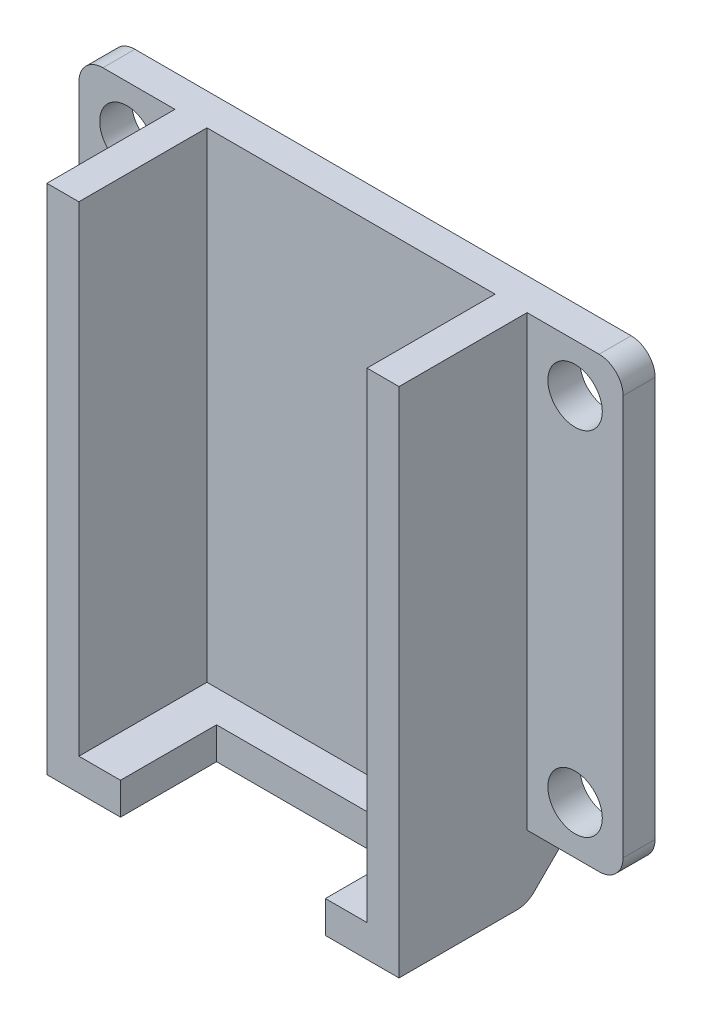
ISO-10303-21;
HEADER;
FILE_DESCRIPTION(('STEP AP214'),'2;1');
FILE_NAME('part.step','',(''),(''),'','','');
FILE_SCHEMA(('AUTOMOTIVE_DESIGN { 1 0 10303 214 1 1 1 1 }'));
ENDSEC;
DATA;
#1=APPLICATION_CONTEXT('core data for automotive mechanical design processes');
#2=APPLICATION_PROTOCOL_DEFINITION('international standard','automotive_design',2000,#1);
#3=PRODUCT_CONTEXT('',#1,'mechanical');
#4=PRODUCT('Part','Part','',(#3));
#5=PRODUCT_RELATED_PRODUCT_CATEGORY('part','',(#4));
#6=PRODUCT_DEFINITION_FORMATION('','',#4);
#7=PRODUCT_DEFINITION_CONTEXT('part definition',#1,'design');
#8=PRODUCT_DEFINITION('design','',#6,#7);
#9=PRODUCT_DEFINITION_SHAPE('','',#8);
#10=(LENGTH_UNIT() NAMED_UNIT(*) SI_UNIT(.MILLI.,.METRE.));
#11=(NAMED_UNIT(*) PLANE_ANGLE_UNIT() SI_UNIT($,.RADIAN.));
#12=(NAMED_UNIT(*) SI_UNIT($,.STERADIAN.) SOLID_ANGLE_UNIT());
#13=UNCERTAINTY_MEASURE_WITH_UNIT(LENGTH_MEASURE(1.E-05),#10,'distance_accuracy_value','');
#14=(GEOMETRIC_REPRESENTATION_CONTEXT(3) GLOBAL_UNCERTAINTY_ASSIGNED_CONTEXT((#13)) GLOBAL_UNIT_ASSIGNED_CONTEXT((#10,
#11,#12)) REPRESENTATION_CONTEXT('',''));
#15=CARTESIAN_POINT('',(0.,0.,0.));
#16=DIRECTION('',(0.,0.,1.));
#17=DIRECTION('',(1.,0.,0.));
#18=AXIS2_PLACEMENT_3D('',#15,#16,#17);
#19=CARTESIAN_POINT('',(0.,0.,2.));
#20=DIRECTION('',(0.,0.,-1.));
#21=DIRECTION('',(-1.,0.,0.));
#22=AXIS2_PLACEMENT_3D('',#19,#20,#21);
#23=PLANE('',#22);
#24=DIRECTION('',(1.,0.,0.));
#25=VECTOR('',#24,1.);
#26=CARTESIAN_POINT('',(0.,-14.,2.));
#27=LINE('',#26,#25);
#28=CARTESIAN_POINT('',(-9.00000000000001,-14.,2.));
#29=VERTEX_POINT('',#28);
#30=CARTESIAN_POINT('',(9.,-14.,2.));
#31=VERTEX_POINT('',#30);
#32=EDGE_CURVE('E238',#29,#31,#27,.T.);
#33=ORIENTED_EDGE('',*,*,#32,.T.);
#34=DIRECTION('',(0.,-1.,0.));
#35=VECTOR('',#34,1.);
#36=CARTESIAN_POINT('',(9.,0.,2.));
#37=LINE('',#36,#35);
#38=CARTESIAN_POINT('',(8.99999999999999,16.,2.));
#39=VERTEX_POINT('',#38);
#40=EDGE_CURVE('E429',#39,#31,#37,.T.);
#41=ORIENTED_EDGE('',*,*,#40,.F.);
#42=DIRECTION('',(-1.,0.,0.));
#43=VECTOR('',#42,1.);
#44=CARTESIAN_POINT('',(-17.,16.,2.));
#45=LINE('',#44,#43);
#46=CARTESIAN_POINT('',(-9.00000000000001,16.,2.));
#47=VERTEX_POINT('',#46);
#48=EDGE_CURVE('E285',#39,#47,#45,.T.);
#49=ORIENTED_EDGE('',*,*,#48,.T.);
#50=DIRECTION('',(0.,-1.,0.));
#51=VECTOR('',#50,1.);
#52=CARTESIAN_POINT('',(-9.00000000000001,0.,2.));
#53=LINE('',#52,#51);
#54=EDGE_CURVE('E239',#47,#29,#53,.T.);
#55=ORIENTED_EDGE('',*,*,#54,.T.);
#56=EDGE_LOOP('',(#33,#41,#49,#55));
#57=FACE_BOUND('',#56,.T.);
#58=ADVANCED_FACE('F47',(#57),#23,.F.);
#59=CARTESIAN_POINT('',(-14.,13.,2.));
#60=DIRECTION('',(0.,0.,1.));
#61=DIRECTION('',(1.,0.,0.));
#62=AXIS2_PLACEMENT_3D('',#59,#60,#61);
#63=CIRCLE('',#62,1.7);
#64=CARTESIAN_POINT('',(-12.3,13.,2.));
#65=VERTEX_POINT('',#64);
#66=EDGE_CURVE('E326',#65,#65,#63,.T.);
#67=ORIENTED_EDGE('',*,*,#66,.F.);
#68=EDGE_LOOP('',(#67));
#69=FACE_BOUND('',#68,.T.);
#70=CARTESIAN_POINT('',(-14.,-9.00000000000001,2.));
#71=DIRECTION('',(0.,0.,1.));
#72=DIRECTION('',(1.,0.,0.));
#73=AXIS2_PLACEMENT_3D('',#70,#71,#72);
#74=CIRCLE('',#73,1.7);
#75=CARTESIAN_POINT('',(-12.3,-9.00000000000001,2.));
#76=VERTEX_POINT('',#75);
#77=EDGE_CURVE('E316',#76,#76,#74,.T.);
#78=ORIENTED_EDGE('',*,*,#77,.F.);
#79=EDGE_LOOP('',(#78));
#80=FACE_BOUND('',#79,.T.);
#81=CARTESIAN_POINT('',(-11.,16.,2.));
#82=VERTEX_POINT('',#81);
#83=CARTESIAN_POINT('',(-15.5,16.,2.));
#84=VERTEX_POINT('',#83);
#85=EDGE_CURVE('E279',#82,#84,#45,.T.);
#86=ORIENTED_EDGE('',*,*,#85,.T.);
#87=CARTESIAN_POINT('',(-15.5,14.5,2.));
#88=DIRECTION('',(0.,0.,-1.));
#89=DIRECTION('',(-1.,0.,0.));
#90=AXIS2_PLACEMENT_3D('',#87,#88,#89);
#91=CIRCLE('',#90,1.5);
#92=CARTESIAN_POINT('',(-17.,14.5,2.));
#93=VERTEX_POINT('',#92);
#94=EDGE_CURVE('E355',#84,#93,#91,.F.);
#95=ORIENTED_EDGE('',*,*,#94,.T.);
#96=DIRECTION('',(0.,-1.,0.));
#97=VECTOR('',#96,1.);
#98=CARTESIAN_POINT('',(-17.,-16.,2.));
#99=LINE('',#98,#97);
#100=CARTESIAN_POINT('',(-17.,-10.5,2.));
#101=VERTEX_POINT('',#100);
#102=EDGE_CURVE('E284',#93,#101,#99,.T.);
#103=ORIENTED_EDGE('',*,*,#102,.T.);
#104=CARTESIAN_POINT('',(-15.5,-10.5,2.));
#105=DIRECTION('',(0.,0.,-1.));
#106=DIRECTION('',(-1.,0.,0.));
#107=AXIS2_PLACEMENT_3D('',#104,#105,#106);
#108=CIRCLE('',#107,1.5);
#109=CARTESIAN_POINT('',(-15.5,-12.,2.));
#110=VERTEX_POINT('',#109);
#111=EDGE_CURVE('E228',#101,#110,#108,.F.);
#112=ORIENTED_EDGE('',*,*,#111,.T.);
#113=DIRECTION('',(-1.,0.,0.));
#114=VECTOR('',#113,1.);
#115=CARTESIAN_POINT('',(-17.,-12.,2.));
#116=LINE('',#115,#114);
#117=CARTESIAN_POINT('',(-11.,-12.,2.));
#118=VERTEX_POINT('',#117);
#119=EDGE_CURVE('E211',#118,#110,#116,.T.);
#120=ORIENTED_EDGE('',*,*,#119,.F.);
#121=DIRECTION('',(0.,-1.,0.));
#122=VECTOR('',#121,1.);
#123=CARTESIAN_POINT('',(-11.,0.,2.));
#124=LINE('',#123,#122);
#125=EDGE_CURVE('E225',#82,#118,#124,.T.);
#126=ORIENTED_EDGE('',*,*,#125,.F.);
#127=EDGE_LOOP('',(#86,#95,#103,#112,#120,#126));
#128=FACE_BOUND('',#127,.T.);
#129=ADVANCED_FACE('F224',(#69,#80,#128),#23,.F.);
#130=CARTESIAN_POINT('',(17.,-16.,2.));
#131=DIRECTION('',(-1.,0.,0.));
#132=DIRECTION('',(0.,0.,1.));
#133=AXIS2_PLACEMENT_3D('',#130,#131,#132);
#134=PLANE('',#133);
#135=DIRECTION('',(0.,1.,0.));
#136=VECTOR('',#135,1.);
#137=CARTESIAN_POINT('',(17.,-16.,0.));
#138=LINE('',#137,#136);
#139=CARTESIAN_POINT('',(17.,-10.5,0.));
#140=VERTEX_POINT('',#139);
#141=CARTESIAN_POINT('',(17.,14.5,0.));
#142=VERTEX_POINT('',#141);
#143=EDGE_CURVE('E274',#140,#142,#138,.T.);
#144=ORIENTED_EDGE('',*,*,#143,.T.);
#145=DIRECTION('',(0.,0.,-1.));
#146=VECTOR('',#145,1.);
#147=CARTESIAN_POINT('',(17.,14.5,2.));
#148=LINE('',#147,#146);
#149=CARTESIAN_POINT('',(17.,14.5,2.));
#150=VERTEX_POINT('',#149);
#151=EDGE_CURVE('E360',#142,#150,#148,.F.);
#152=ORIENTED_EDGE('',*,*,#151,.T.);
#153=DIRECTION('',(0.,1.,0.));
#154=VECTOR('',#153,1.);
#155=CARTESIAN_POINT('',(17.,-16.,2.));
#156=LINE('',#155,#154);
#157=CARTESIAN_POINT('',(17.,-10.5,2.));
#158=VERTEX_POINT('',#157);
#159=EDGE_CURVE('E275',#158,#150,#156,.T.);
#160=ORIENTED_EDGE('',*,*,#159,.F.);
#161=DIRECTION('',(0.,0.,1.));
#162=VECTOR('',#161,1.);
#163=CARTESIAN_POINT('',(17.,-10.5,2.));
#164=LINE('',#163,#162);
#165=EDGE_CURVE('E357',#158,#140,#164,.F.);
#166=ORIENTED_EDGE('',*,*,#165,.T.);
#167=EDGE_LOOP('',(#144,#152,#160,#166));
#168=FACE_BOUND('',#167,.T.);
#169=ADVANCED_FACE('F569',(#168),#134,.F.);
#170=CARTESIAN_POINT('',(-17.,16.,2.));
#171=DIRECTION('',(0.,-1.,0.));
#172=DIRECTION('',(0.,0.,-1.));
#173=AXIS2_PLACEMENT_3D('',#170,#171,#172);
#174=PLANE('',#173);
#175=DIRECTION('',(-1.,0.,0.));
#176=VECTOR('',#175,1.);
#177=CARTESIAN_POINT('',(-17.,16.,0.));
#178=LINE('',#177,#176);
#179=CARTESIAN_POINT('',(15.5,16.,0.));
#180=VERTEX_POINT('',#179);
#181=CARTESIAN_POINT('',(-15.5,16.,0.));
#182=VERTEX_POINT('',#181);
#183=EDGE_CURVE('E292',#180,#182,#178,.T.);
#184=ORIENTED_EDGE('',*,*,#183,.T.);
#185=DIRECTION('',(0.,0.,-1.));
#186=VECTOR('',#185,1.);
#187=CARTESIAN_POINT('',(-15.5,16.,2.));
#188=LINE('',#187,#186);
#189=EDGE_CURVE('E350',#182,#84,#188,.F.);
#190=ORIENTED_EDGE('',*,*,#189,.T.);
#191=ORIENTED_EDGE('',*,*,#85,.F.);
#192=DIRECTION('',(0.,0.,-1.));
#193=VECTOR('',#192,1.);
#194=CARTESIAN_POINT('',(-11.,16.,10.));
#195=LINE('',#194,#193);
#196=CARTESIAN_POINT('',(-11.,16.,10.));
#197=VERTEX_POINT('',#196);
#198=EDGE_CURVE('E236',#197,#82,#195,.T.);
#199=ORIENTED_EDGE('',*,*,#198,.F.);
#200=DIRECTION('',(-1.,0.,0.));
#201=VECTOR('',#200,1.);
#202=CARTESIAN_POINT('',(0.,16.,10.));
#203=LINE('',#202,#201);
#204=CARTESIAN_POINT('',(-9.00000000000001,16.,10.));
#205=VERTEX_POINT('',#204);
#206=EDGE_CURVE('E481',#205,#197,#203,.T.);
#207=ORIENTED_EDGE('',*,*,#206,.F.);
#208=DIRECTION('',(0.,0.,-1.));
#209=VECTOR('',#208,1.);
#210=CARTESIAN_POINT('',(-9.00000000000001,16.,10.));
#211=LINE('',#210,#209);
#212=EDGE_CURVE('E270',#205,#47,#211,.T.);
#213=ORIENTED_EDGE('',*,*,#212,.T.);
#214=ORIENTED_EDGE('',*,*,#48,.F.);
#215=DIRECTION('',(0.,0.,-1.));
#216=VECTOR('',#215,1.);
#217=CARTESIAN_POINT('',(8.99999999999999,16.,10.));
#218=LINE('',#217,#216);
#219=CARTESIAN_POINT('',(8.99999999999999,16.,10.));
#220=VERTEX_POINT('',#219);
#221=EDGE_CURVE('E247',#220,#39,#218,.T.);
#222=ORIENTED_EDGE('',*,*,#221,.F.);
#223=DIRECTION('',(-1.,0.,0.));
#224=VECTOR('',#223,1.);
#225=CARTESIAN_POINT('',(0.,16.,10.));
#226=LINE('',#225,#224);
#227=CARTESIAN_POINT('',(11.,16.,10.));
#228=VERTEX_POINT('',#227);
#229=EDGE_CURVE('E430',#228,#220,#226,.T.);
#230=ORIENTED_EDGE('',*,*,#229,.F.);
#231=DIRECTION('',(0.,0.,-1.));
#232=VECTOR('',#231,1.);
#233=CARTESIAN_POINT('',(11.,16.,10.));
#234=LINE('',#233,#232);
#235=CARTESIAN_POINT('',(11.,16.,2.));
#236=VERTEX_POINT('',#235);
#237=EDGE_CURVE('E451',#228,#236,#234,.T.);
#238=ORIENTED_EDGE('',*,*,#237,.T.);
#239=CARTESIAN_POINT('',(15.5,16.,2.));
#240=VERTEX_POINT('',#239);
#241=EDGE_CURVE('E281',#240,#236,#45,.T.);
#242=ORIENTED_EDGE('',*,*,#241,.F.);
#243=DIRECTION('',(0.,0.,-1.));
#244=VECTOR('',#243,1.);
#245=CARTESIAN_POINT('',(15.5,16.,2.));
#246=LINE('',#245,#244);
#247=EDGE_CURVE('E346',#240,#180,#246,.T.);
#248=ORIENTED_EDGE('',*,*,#247,.T.);
#249=EDGE_LOOP('',(#184,#190,#191,#199,#207,#213,#214,#222,#230,#238,#242,#248));
#250=FACE_BOUND('',#249,.T.);
#251=ADVANCED_FACE('F532',(#250),#174,.F.);
#252=CARTESIAN_POINT('',(-17.,-16.,2.));
#253=DIRECTION('',(1.,0.,0.));
#254=DIRECTION('',(0.,0.,-1.));
#255=AXIS2_PLACEMENT_3D('',#252,#253,#254);
#256=PLANE('',#255);
#257=ORIENTED_EDGE('',*,*,#102,.F.);
#258=DIRECTION('',(0.,0.,-1.));
#259=VECTOR('',#258,1.);
#260=CARTESIAN_POINT('',(-17.,14.5,2.));
#261=LINE('',#260,#259);
#262=CARTESIAN_POINT('',(-17.,14.5,0.));
#263=VERTEX_POINT('',#262);
#264=EDGE_CURVE('E330',#93,#263,#261,.T.);
#265=ORIENTED_EDGE('',*,*,#264,.T.);
#266=DIRECTION('',(0.,-1.,0.));
#267=VECTOR('',#266,1.);
#268=CARTESIAN_POINT('',(-17.,-16.,0.));
#269=LINE('',#268,#267);
#270=CARTESIAN_POINT('',(-17.,-10.5,0.));
#271=VERTEX_POINT('',#270);
#272=EDGE_CURVE('E280',#263,#271,#269,.T.);
#273=ORIENTED_EDGE('',*,*,#272,.T.);
#274=DIRECTION('',(0.,0.,1.));
#275=VECTOR('',#274,1.);
#276=CARTESIAN_POINT('',(-17.,-10.5,2.));
#277=LINE('',#276,#275);
#278=EDGE_CURVE('E310',#271,#101,#277,.T.);
#279=ORIENTED_EDGE('',*,*,#278,.T.);
#280=EDGE_LOOP('',(#257,#265,#273,#279));
#281=FACE_BOUND('',#280,.T.);
#282=ADVANCED_FACE('F545',(#281),#256,.F.);
#283=CARTESIAN_POINT('',(-17.,-16.,2.));
#284=DIRECTION('',(0.,1.,0.));
#285=DIRECTION('',(0.,0.,1.));
#286=AXIS2_PLACEMENT_3D('',#283,#284,#285);
#287=PLANE('',#286);
#288=DIRECTION('',(0.,0.,-1.));
#289=VECTOR('',#288,1.);
#290=CARTESIAN_POINT('',(-11.,-16.,10.));
#291=LINE('',#290,#289);
#292=CARTESIAN_POINT('',(-11.,-16.,10.));
#293=VERTEX_POINT('',#292);
#294=CARTESIAN_POINT('',(-11.,-16.,2.62132034355964));
#295=VERTEX_POINT('',#294);
#296=EDGE_CURVE('E264',#293,#295,#291,.T.);
#297=ORIENTED_EDGE('',*,*,#296,.T.);
#298=DIRECTION('',(1.,0.,0.));
#299=VECTOR('',#298,1.);
#300=CARTESIAN_POINT('',(11.,-16.,2.62132034355964));
#301=LINE('',#300,#299);
#302=CARTESIAN_POINT('',(11.,-16.,2.62132034355964));
#303=VERTEX_POINT('',#302);
#304=EDGE_CURVE('E385',#295,#303,#301,.T.);
#305=ORIENTED_EDGE('',*,*,#304,.T.);
#306=DIRECTION('',(0.,0.,-1.));
#307=VECTOR('',#306,1.);
#308=CARTESIAN_POINT('',(11.,-16.,10.));
#309=LINE('',#308,#307);
#310=CARTESIAN_POINT('',(11.,-16.,10.));
#311=VERTEX_POINT('',#310);
#312=EDGE_CURVE('E461',#311,#303,#309,.T.);
#313=ORIENTED_EDGE('',*,*,#312,.F.);
#314=DIRECTION('',(1.,0.,0.));
#315=VECTOR('',#314,1.);
#316=CARTESIAN_POINT('',(0.,-16.,10.));
#317=LINE('',#316,#315);
#318=CARTESIAN_POINT('',(6.4,-16.,10.));
#319=VERTEX_POINT('',#318);
#320=EDGE_CURVE('E445',#319,#311,#317,.T.);
#321=ORIENTED_EDGE('',*,*,#320,.F.);
#322=DIRECTION('',(0.,0.,-1.));
#323=VECTOR('',#322,1.);
#324=CARTESIAN_POINT('',(6.4,-16.,10.));
#325=LINE('',#324,#323);
#326=CARTESIAN_POINT('',(6.4,-16.,4.));
#327=VERTEX_POINT('',#326);
#328=EDGE_CURVE('E464',#319,#327,#325,.T.);
#329=ORIENTED_EDGE('',*,*,#328,.T.);
#330=DIRECTION('',(1.,0.,0.));
#331=VECTOR('',#330,1.);
#332=CARTESIAN_POINT('',(0.,-16.,4.));
#333=LINE('',#332,#331);
#334=CARTESIAN_POINT('',(-6.4,-16.,4.));
#335=VERTEX_POINT('',#334);
#336=EDGE_CURVE('E426',#335,#327,#333,.T.);
#337=ORIENTED_EDGE('',*,*,#336,.F.);
#338=DIRECTION('',(0.,0.,-1.));
#339=VECTOR('',#338,1.);
#340=CARTESIAN_POINT('',(-6.4,-16.,10.));
#341=LINE('',#340,#339);
#342=CARTESIAN_POINT('',(-6.4,-16.,10.));
#343=VERTEX_POINT('',#342);
#344=EDGE_CURVE('E260',#343,#335,#341,.T.);
#345=ORIENTED_EDGE('',*,*,#344,.F.);
#346=DIRECTION('',(1.,0.,0.));
#347=VECTOR('',#346,1.);
#348=CARTESIAN_POINT('',(0.,-16.,10.));
#349=LINE('',#348,#347);
#350=EDGE_CURVE('E487',#293,#343,#349,.T.);
#351=ORIENTED_EDGE('',*,*,#350,.F.);
#352=EDGE_LOOP('',(#297,#305,#313,#321,#329,#337,#345,#351));
#353=FACE_BOUND('',#352,.T.);
#354=ADVANCED_FACE('F512',(#353),#287,.F.);
#355=CARTESIAN_POINT('',(14.,-9.00000000000001,2.));
#356=DIRECTION('',(0.,0.,1.));
#357=DIRECTION('',(1.,0.,0.));
#358=AXIS2_PLACEMENT_3D('',#355,#356,#357);
#359=CIRCLE('',#358,1.7);
#360=CARTESIAN_POINT('',(15.7,-9.00000000000001,2.));
#361=VERTEX_POINT('',#360);
#362=EDGE_CURVE('E321',#361,#361,#359,.T.);
#363=ORIENTED_EDGE('',*,*,#362,.F.);
#364=EDGE_LOOP('',(#363));
#365=FACE_BOUND('',#364,.T.);
#366=CARTESIAN_POINT('',(14.,13.,2.));
#367=DIRECTION('',(0.,0.,1.));
#368=DIRECTION('',(1.,0.,0.));
#369=AXIS2_PLACEMENT_3D('',#366,#367,#368);
#370=CIRCLE('',#369,1.7);
#371=CARTESIAN_POINT('',(15.7,13.,2.));
#372=VERTEX_POINT('',#371);
#373=EDGE_CURVE('E315',#372,#372,#370,.T.);
#374=ORIENTED_EDGE('',*,*,#373,.F.);
#375=EDGE_LOOP('',(#374));
#376=FACE_BOUND('',#375,.T.);
#377=ORIENTED_EDGE('',*,*,#159,.T.);
#378=CARTESIAN_POINT('',(15.5,14.5,2.));
#379=DIRECTION('',(0.,0.,-1.));
#380=DIRECTION('',(-1.,0.,0.));
#381=AXIS2_PLACEMENT_3D('',#378,#379,#380);
#382=CIRCLE('',#381,1.5);
#383=EDGE_CURVE('E366',#150,#240,#382,.F.);
#384=ORIENTED_EDGE('',*,*,#383,.T.);
#385=ORIENTED_EDGE('',*,*,#241,.T.);
#386=DIRECTION('',(0.,-1.,0.));
#387=VECTOR('',#386,1.);
#388=CARTESIAN_POINT('',(11.,0.,2.));
#389=LINE('',#388,#387);
#390=CARTESIAN_POINT('',(11.,-12.,2.));
#391=VERTEX_POINT('',#390);
#392=EDGE_CURVE('E435',#236,#391,#389,.T.);
#393=ORIENTED_EDGE('',*,*,#392,.T.);
#394=DIRECTION('',(-1.,0.,0.));
#395=VECTOR('',#394,1.);
#396=CARTESIAN_POINT('',(17.,-12.,2.));
#397=LINE('',#396,#395);
#398=CARTESIAN_POINT('',(15.5,-12.,2.));
#399=VERTEX_POINT('',#398);
#400=EDGE_CURVE('E230',#399,#391,#397,.T.);
#401=ORIENTED_EDGE('',*,*,#400,.F.);
#402=CARTESIAN_POINT('',(15.5,-10.5,2.));
#403=DIRECTION('',(0.,0.,-1.));
#404=DIRECTION('',(-1.,0.,0.));
#405=AXIS2_PLACEMENT_3D('',#402,#403,#404);
#406=CIRCLE('',#405,1.5);
#407=EDGE_CURVE('E363',#399,#158,#406,.F.);
#408=ORIENTED_EDGE('',*,*,#407,.T.);
#409=EDGE_LOOP('',(#377,#384,#385,#393,#401,#408));
#410=FACE_BOUND('',#409,.T.);
#411=ADVANCED_FACE('F566',(#365,#376,#410),#23,.F.);
#412=CARTESIAN_POINT('',(0.,0.,0.));
#413=DIRECTION('',(0.,0.,-1.));
#414=DIRECTION('',(-1.,0.,0.));
#415=AXIS2_PLACEMENT_3D('',#412,#413,#414);
#416=PLANE('',#415);
#417=CARTESIAN_POINT('',(-14.,13.,0.));
#418=DIRECTION('',(0.,0.,-1.));
#419=DIRECTION('',(-1.,0.,0.));
#420=AXIS2_PLACEMENT_3D('',#417,#418,#419);
#421=CIRCLE('',#420,1.7);
#422=CARTESIAN_POINT('',(-15.7,13.,0.));
#423=VERTEX_POINT('',#422);
#424=EDGE_CURVE('E322',#423,#423,#421,.T.);
#425=ORIENTED_EDGE('',*,*,#424,.F.);
#426=EDGE_LOOP('',(#425));
#427=FACE_BOUND('',#426,.T.);
#428=CARTESIAN_POINT('',(14.,-9.00000000000001,0.));
#429=DIRECTION('',(0.,0.,-1.));
#430=DIRECTION('',(-1.,0.,0.));
#431=AXIS2_PLACEMENT_3D('',#428,#429,#430);
#432=CIRCLE('',#431,1.7);
#433=CARTESIAN_POINT('',(12.3,-9.00000000000001,0.));
#434=VERTEX_POINT('',#433);
#435=EDGE_CURVE('E317',#434,#434,#432,.T.);
#436=ORIENTED_EDGE('',*,*,#435,.F.);
#437=EDGE_LOOP('',(#436));
#438=FACE_BOUND('',#437,.T.);
#439=CARTESIAN_POINT('',(-14.,-9.00000000000001,0.));
#440=DIRECTION('',(0.,0.,-1.));
#441=DIRECTION('',(-1.,0.,0.));
#442=AXIS2_PLACEMENT_3D('',#439,#440,#441);
#443=CIRCLE('',#442,1.7);
#444=CARTESIAN_POINT('',(-15.7,-9.00000000000001,0.));
#445=VERTEX_POINT('',#444);
#446=EDGE_CURVE('E311',#445,#445,#443,.T.);
#447=ORIENTED_EDGE('',*,*,#446,.F.);
#448=EDGE_LOOP('',(#447));
#449=FACE_BOUND('',#448,.T.);
#450=CARTESIAN_POINT('',(14.,13.,0.));
#451=DIRECTION('',(0.,0.,-1.));
#452=DIRECTION('',(-1.,0.,0.));
#453=AXIS2_PLACEMENT_3D('',#450,#451,#452);
#454=CIRCLE('',#453,1.7);
#455=CARTESIAN_POINT('',(12.3,13.,0.));
#456=VERTEX_POINT('',#455);
#457=EDGE_CURVE('E392',#456,#456,#454,.T.);
#458=ORIENTED_EDGE('',*,*,#457,.F.);
#459=EDGE_LOOP('',(#458));
#460=FACE_BOUND('',#459,.T.);
#461=DIRECTION('',(0.,1.,0.));
#462=VECTOR('',#461,1.);
#463=CARTESIAN_POINT('',(11.,0.,0.));
#464=LINE('',#463,#462);
#465=CARTESIAN_POINT('',(11.,-14.,0.));
#466=VERTEX_POINT('',#465);
#467=CARTESIAN_POINT('',(11.,-12.,0.));
#468=VERTEX_POINT('',#467);
#469=EDGE_CURVE('E302',#466,#468,#464,.T.);
#470=ORIENTED_EDGE('',*,*,#469,.F.);
#471=DIRECTION('',(-1.,0.,0.));
#472=VECTOR('',#471,1.);
#473=CARTESIAN_POINT('',(-11.,-14.,0.));
#474=LINE('',#473,#472);
#475=CARTESIAN_POINT('',(-11.,-14.,0.));
#476=VERTEX_POINT('',#475);
#477=EDGE_CURVE('E379',#466,#476,#474,.T.);
#478=ORIENTED_EDGE('',*,*,#477,.T.);
#479=DIRECTION('',(0.,-1.,0.));
#480=VECTOR('',#479,1.);
#481=CARTESIAN_POINT('',(-11.,0.,0.));
#482=LINE('',#481,#480);
#483=CARTESIAN_POINT('',(-11.,-12.,0.));
#484=VERTEX_POINT('',#483);
#485=EDGE_CURVE('E305',#484,#476,#482,.T.);
#486=ORIENTED_EDGE('',*,*,#485,.F.);
#487=DIRECTION('',(1.,0.,0.));
#488=VECTOR('',#487,1.);
#489=CARTESIAN_POINT('',(0.,-12.,0.));
#490=LINE('',#489,#488);
#491=CARTESIAN_POINT('',(-15.5,-12.,0.));
#492=VERTEX_POINT('',#491);
#493=EDGE_CURVE('E214',#492,#484,#490,.T.);
#494=ORIENTED_EDGE('',*,*,#493,.F.);
#495=CARTESIAN_POINT('',(-15.5,-10.5,0.));
#496=DIRECTION('',(0.,0.,-1.));
#497=DIRECTION('',(-1.,0.,0.));
#498=AXIS2_PLACEMENT_3D('',#495,#496,#497);
#499=CIRCLE('',#498,1.5);
#500=EDGE_CURVE('E334',#492,#271,#499,.T.);
#501=ORIENTED_EDGE('',*,*,#500,.T.);
#502=ORIENTED_EDGE('',*,*,#272,.F.);
#503=CARTESIAN_POINT('',(-15.5,14.5,0.));
#504=DIRECTION('',(0.,0.,-1.));
#505=DIRECTION('',(-1.,0.,0.));
#506=AXIS2_PLACEMENT_3D('',#503,#504,#505);
#507=CIRCLE('',#506,1.5);
#508=EDGE_CURVE('E343',#263,#182,#507,.T.);
#509=ORIENTED_EDGE('',*,*,#508,.T.);
#510=ORIENTED_EDGE('',*,*,#183,.F.);
#511=CARTESIAN_POINT('',(15.5,14.5,0.));
#512=DIRECTION('',(0.,0.,-1.));
#513=DIRECTION('',(-1.,0.,0.));
#514=AXIS2_PLACEMENT_3D('',#511,#512,#513);
#515=CIRCLE('',#514,1.5);
#516=EDGE_CURVE('E340',#180,#142,#515,.T.);
#517=ORIENTED_EDGE('',*,*,#516,.T.);
#518=ORIENTED_EDGE('',*,*,#143,.F.);
#519=CARTESIAN_POINT('',(15.5,-10.5,0.));
#520=DIRECTION('',(0.,0.,-1.));
#521=DIRECTION('',(-1.,0.,0.));
#522=AXIS2_PLACEMENT_3D('',#519,#520,#521);
#523=CIRCLE('',#522,1.5);
#524=CARTESIAN_POINT('',(15.5,-12.,0.));
#525=VERTEX_POINT('',#524);
#526=EDGE_CURVE('E337',#140,#525,#523,.T.);
#527=ORIENTED_EDGE('',*,*,#526,.T.);
#528=DIRECTION('',(1.,0.,0.));
#529=VECTOR('',#528,1.);
#530=CARTESIAN_POINT('',(0.,-12.,0.));
#531=LINE('',#530,#529);
#532=EDGE_CURVE('E288',#468,#525,#531,.T.);
#533=ORIENTED_EDGE('',*,*,#532,.F.);
#534=EDGE_LOOP('',(#470,#478,#486,#494,#501,#502,#509,#510,#517,#518,#527,#533));
#535=FACE_BOUND('',#534,.T.);
#536=ADVANCED_FACE('F549',(#427,#438,#449,#460,#535),#416,.T.);
#537=CARTESIAN_POINT('',(-9.00000000000001,0.,10.));
#538=DIRECTION('',(1.,0.,0.));
#539=DIRECTION('',(0.,1.,0.));
#540=AXIS2_PLACEMENT_3D('',#537,#538,#539);
#541=PLANE('',#540);
#542=ORIENTED_EDGE('',*,*,#54,.F.);
#543=ORIENTED_EDGE('',*,*,#212,.F.);
#544=DIRECTION('',(0.,-1.,0.));
#545=VECTOR('',#544,1.);
#546=CARTESIAN_POINT('',(-9.00000000000001,0.,10.));
#547=LINE('',#546,#545);
#548=CARTESIAN_POINT('',(-9.00000000000001,-14.,10.));
#549=VERTEX_POINT('',#548);
#550=EDGE_CURVE('E244',#205,#549,#547,.T.);
#551=ORIENTED_EDGE('',*,*,#550,.T.);
#552=DIRECTION('',(0.,0.,-1.));
#553=VECTOR('',#552,1.);
#554=CARTESIAN_POINT('',(-9.00000000000001,-14.,10.));
#555=LINE('',#554,#553);
#556=EDGE_CURVE('E251',#549,#29,#555,.T.);
#557=ORIENTED_EDGE('',*,*,#556,.T.);
#558=EDGE_LOOP('',(#542,#543,#551,#557));
#559=FACE_BOUND('',#558,.T.);
#560=ADVANCED_FACE('F578',(#559),#541,.T.);
#561=CARTESIAN_POINT('',(-11.,0.,10.));
#562=DIRECTION('',(1.,0.,0.));
#563=DIRECTION('',(0.,1.,0.));
#564=AXIS2_PLACEMENT_3D('',#561,#562,#563);
#565=PLANE('',#564);
#566=DIRECTION('',(0.,-0.707106781186549,0.707106781186546));
#567=VECTOR('',#566,1.);
#568=CARTESIAN_POINT('',(-11.,-16.,1.99999999999999));
#569=LINE('',#568,#567);
#570=CARTESIAN_POINT('',(-11.,-15.5606601717798,1.56066017177982));
#571=VERTEX_POINT('',#570);
#572=EDGE_CURVE('E382',#476,#571,#569,.T.);
#573=ORIENTED_EDGE('',*,*,#572,.T.);
#574=CARTESIAN_POINT('',(-11.,-14.5,2.62132034355964));
#575=DIRECTION('',(1.,0.,0.));
#576=DIRECTION('',(0.,1.,0.));
#577=AXIS2_PLACEMENT_3D('',#574,#575,#576);
#578=CIRCLE('',#577,1.5);
#579=EDGE_CURVE('E11',#571,#295,#578,.F.);
#580=ORIENTED_EDGE('',*,*,#579,.T.);
#581=ORIENTED_EDGE('',*,*,#296,.F.);
#582=DIRECTION('',(0.,-1.,0.));
#583=VECTOR('',#582,1.);
#584=CARTESIAN_POINT('',(-11.,0.,10.));
#585=LINE('',#584,#583);
#586=EDGE_CURVE('E484',#197,#293,#585,.T.);
#587=ORIENTED_EDGE('',*,*,#586,.F.);
#588=ORIENTED_EDGE('',*,*,#198,.T.);
#589=ORIENTED_EDGE('',*,*,#125,.T.);
#590=DIRECTION('',(0.,0.,1.));
#591=VECTOR('',#590,1.);
#592=CARTESIAN_POINT('',(-11.,-12.,-7.));
#593=LINE('',#592,#591);
#594=EDGE_CURVE('E208',#484,#118,#593,.T.);
#595=ORIENTED_EDGE('',*,*,#594,.F.);
#596=ORIENTED_EDGE('',*,*,#485,.T.);
#597=EDGE_LOOP('',(#573,#580,#581,#587,#588,#589,#595,#596));
#598=FACE_BOUND('',#597,.T.);
#599=ADVANCED_FACE('F233',(#598),#565,.F.);
#600=CARTESIAN_POINT('',(-6.4,0.,10.));
#601=DIRECTION('',(1.,0.,0.));
#602=DIRECTION('',(0.,0.,-1.));
#603=AXIS2_PLACEMENT_3D('',#600,#601,#602);
#604=PLANE('',#603);
#605=DIRECTION('',(0.,-1.,0.));
#606=VECTOR('',#605,1.);
#607=CARTESIAN_POINT('',(-6.4,0.,4.));
#608=LINE('',#607,#606);
#609=CARTESIAN_POINT('',(-6.4,-14.,4.));
#610=VERTEX_POINT('',#609);
#611=EDGE_CURVE('E423',#610,#335,#608,.T.);
#612=ORIENTED_EDGE('',*,*,#611,.F.);
#613=DIRECTION('',(0.,0.,-1.));
#614=VECTOR('',#613,1.);
#615=CARTESIAN_POINT('',(-6.4,-14.,10.));
#616=LINE('',#615,#614);
#617=CARTESIAN_POINT('',(-6.4,-14.,10.));
#618=VERTEX_POINT('',#617);
#619=EDGE_CURVE('E255',#618,#610,#616,.T.);
#620=ORIENTED_EDGE('',*,*,#619,.F.);
#621=DIRECTION('',(0.,-1.,0.));
#622=VECTOR('',#621,1.);
#623=CARTESIAN_POINT('',(-6.4,0.,10.));
#624=LINE('',#623,#622);
#625=EDGE_CURVE('E490',#618,#343,#624,.T.);
#626=ORIENTED_EDGE('',*,*,#625,.T.);
#627=ORIENTED_EDGE('',*,*,#344,.T.);
#628=EDGE_LOOP('',(#612,#620,#626,#627));
#629=FACE_BOUND('',#628,.T.);
#630=ADVANCED_FACE('F507',(#629),#604,.T.);
#631=CARTESIAN_POINT('',(0.,-14.,10.));
#632=DIRECTION('',(0.,1.,0.));
#633=DIRECTION('',(-1.,0.,0.));
#634=AXIS2_PLACEMENT_3D('',#631,#632,#633);
#635=PLANE('',#634);
#636=ORIENTED_EDGE('',*,*,#32,.F.);
#637=ORIENTED_EDGE('',*,*,#556,.F.);
#638=DIRECTION('',(1.,0.,0.));
#639=VECTOR('',#638,1.);
#640=CARTESIAN_POINT('',(0.,-14.,10.));
#641=LINE('',#640,#639);
#642=EDGE_CURVE('E256',#549,#618,#641,.T.);
#643=ORIENTED_EDGE('',*,*,#642,.T.);
#644=ORIENTED_EDGE('',*,*,#619,.T.);
#645=DIRECTION('',(1.,0.,0.));
#646=VECTOR('',#645,1.);
#647=CARTESIAN_POINT('',(0.,-14.,4.));
#648=LINE('',#647,#646);
#649=CARTESIAN_POINT('',(6.4,-14.,4.));
#650=VERTEX_POINT('',#649);
#651=EDGE_CURVE('E419',#610,#650,#648,.T.);
#652=ORIENTED_EDGE('',*,*,#651,.T.);
#653=DIRECTION('',(0.,0.,-1.));
#654=VECTOR('',#653,1.);
#655=CARTESIAN_POINT('',(6.4,-14.,10.));
#656=LINE('',#655,#654);
#657=CARTESIAN_POINT('',(6.4,-14.,10.));
#658=VERTEX_POINT('',#657);
#659=EDGE_CURVE('E468',#658,#650,#656,.T.);
#660=ORIENTED_EDGE('',*,*,#659,.F.);
#661=DIRECTION('',(1.,0.,0.));
#662=VECTOR('',#661,1.);
#663=CARTESIAN_POINT('',(0.,-14.,10.));
#664=LINE('',#663,#662);
#665=CARTESIAN_POINT('',(9.,-14.,10.));
#666=VERTEX_POINT('',#665);
#667=EDGE_CURVE('E438',#658,#666,#664,.T.);
#668=ORIENTED_EDGE('',*,*,#667,.T.);
#669=DIRECTION('',(0.,0.,-1.));
#670=VECTOR('',#669,1.);
#671=CARTESIAN_POINT('',(9.,-14.,10.));
#672=LINE('',#671,#670);
#673=EDGE_CURVE('E472',#666,#31,#672,.T.);
#674=ORIENTED_EDGE('',*,*,#673,.T.);
#675=EDGE_LOOP('',(#636,#637,#643,#644,#652,#660,#668,#674));
#676=FACE_BOUND('',#675,.T.);
#677=ADVANCED_FACE('F498',(#676),#635,.T.);
#678=CARTESIAN_POINT('',(0.,0.,10.));
#679=DIRECTION('',(0.,0.,1.));
#680=DIRECTION('',(1.,0.,0.));
#681=AXIS2_PLACEMENT_3D('',#678,#679,#680);
#682=PLANE('',#681);
#683=ORIENTED_EDGE('',*,*,#550,.F.);
#684=ORIENTED_EDGE('',*,*,#206,.T.);
#685=ORIENTED_EDGE('',*,*,#586,.T.);
#686=ORIENTED_EDGE('',*,*,#350,.T.);
#687=ORIENTED_EDGE('',*,*,#625,.F.);
#688=ORIENTED_EDGE('',*,*,#642,.F.);
#689=EDGE_LOOP('',(#683,#684,#685,#686,#687,#688));
#690=FACE_BOUND('',#689,.T.);
#691=ADVANCED_FACE('F502',(#690),#682,.T.);
#692=CARTESIAN_POINT('',(9.,0.,10.));
#693=DIRECTION('',(1.,0.,0.));
#694=DIRECTION('',(0.,1.,0.));
#695=AXIS2_PLACEMENT_3D('',#692,#693,#694);
#696=PLANE('',#695);
#697=ORIENTED_EDGE('',*,*,#40,.T.);
#698=ORIENTED_EDGE('',*,*,#673,.F.);
#699=DIRECTION('',(0.,-1.,0.));
#700=VECTOR('',#699,1.);
#701=CARTESIAN_POINT('',(9.,0.,10.));
#702=LINE('',#701,#700);
#703=EDGE_CURVE('E434',#220,#666,#702,.T.);
#704=ORIENTED_EDGE('',*,*,#703,.F.);
#705=ORIENTED_EDGE('',*,*,#221,.T.);
#706=EDGE_LOOP('',(#697,#698,#704,#705));
#707=FACE_BOUND('',#706,.T.);
#708=ADVANCED_FACE('F527',(#707),#696,.F.);
#709=CARTESIAN_POINT('',(6.4,0.,10.));
#710=DIRECTION('',(1.,0.,0.));
#711=DIRECTION('',(0.,0.,-1.));
#712=AXIS2_PLACEMENT_3D('',#709,#710,#711);
#713=PLANE('',#712);
#714=ORIENTED_EDGE('',*,*,#659,.T.);
#715=DIRECTION('',(0.,-1.,0.));
#716=VECTOR('',#715,1.);
#717=CARTESIAN_POINT('',(6.4,0.,4.));
#718=LINE('',#717,#716);
#719=EDGE_CURVE('E220',#650,#327,#718,.T.);
#720=ORIENTED_EDGE('',*,*,#719,.T.);
#721=ORIENTED_EDGE('',*,*,#328,.F.);
#722=DIRECTION('',(0.,-1.,0.));
#723=VECTOR('',#722,1.);
#724=CARTESIAN_POINT('',(6.4,0.,10.));
#725=LINE('',#724,#723);
#726=EDGE_CURVE('E442',#658,#319,#725,.T.);
#727=ORIENTED_EDGE('',*,*,#726,.F.);
#728=EDGE_LOOP('',(#714,#720,#721,#727));
#729=FACE_BOUND('',#728,.T.);
#730=ADVANCED_FACE('F518',(#729),#713,.F.);
#731=CARTESIAN_POINT('',(11.,0.,10.));
#732=DIRECTION('',(1.,0.,0.));
#733=DIRECTION('',(0.,1.,0.));
#734=AXIS2_PLACEMENT_3D('',#731,#732,#733);
#735=PLANE('',#734);
#736=ORIENTED_EDGE('',*,*,#312,.T.);
#737=CARTESIAN_POINT('',(11.,-14.5,2.62132034355964));
#738=DIRECTION('',(1.,0.,0.));
#739=DIRECTION('',(0.,1.,0.));
#740=AXIS2_PLACEMENT_3D('',#737,#738,#739);
#741=CIRCLE('',#740,1.5);
#742=CARTESIAN_POINT('',(11.,-15.5606601717798,1.56066017177982));
#743=VERTEX_POINT('',#742);
#744=EDGE_CURVE('E70',#303,#743,#741,.T.);
#745=ORIENTED_EDGE('',*,*,#744,.T.);
#746=DIRECTION('',(0.,0.707106781186549,-0.707106781186546));
#747=VECTOR('',#746,1.);
#748=CARTESIAN_POINT('',(11.,-12.,-2.00000000000002));
#749=LINE('',#748,#747);
#750=EDGE_CURVE('E376',#743,#466,#749,.T.);
#751=ORIENTED_EDGE('',*,*,#750,.T.);
#752=ORIENTED_EDGE('',*,*,#469,.T.);
#753=DIRECTION('',(0.,0.,1.));
#754=VECTOR('',#753,1.);
#755=CARTESIAN_POINT('',(11.,-12.,-7.));
#756=LINE('',#755,#754);
#757=EDGE_CURVE('E394',#468,#391,#756,.T.);
#758=ORIENTED_EDGE('',*,*,#757,.T.);
#759=ORIENTED_EDGE('',*,*,#392,.F.);
#760=ORIENTED_EDGE('',*,*,#237,.F.);
#761=DIRECTION('',(0.,-1.,0.));
#762=VECTOR('',#761,1.);
#763=CARTESIAN_POINT('',(11.,0.,10.));
#764=LINE('',#763,#762);
#765=EDGE_CURVE('E447',#228,#311,#764,.T.);
#766=ORIENTED_EDGE('',*,*,#765,.T.);
#767=EDGE_LOOP('',(#736,#745,#751,#752,#758,#759,#760,#766));
#768=FACE_BOUND('',#767,.T.);
#769=ADVANCED_FACE('F602',(#768),#735,.T.);
#770=CARTESIAN_POINT('',(0.,0.,10.));
#771=DIRECTION('',(0.,0.,1.));
#772=DIRECTION('',(1.,0.,0.));
#773=AXIS2_PLACEMENT_3D('',#770,#771,#772);
#774=PLANE('',#773);
#775=ORIENTED_EDGE('',*,*,#229,.T.);
#776=ORIENTED_EDGE('',*,*,#703,.T.);
#777=ORIENTED_EDGE('',*,*,#667,.F.);
#778=ORIENTED_EDGE('',*,*,#726,.T.);
#779=ORIENTED_EDGE('',*,*,#320,.T.);
#780=ORIENTED_EDGE('',*,*,#765,.F.);
#781=EDGE_LOOP('',(#775,#776,#777,#778,#779,#780));
#782=FACE_BOUND('',#781,.T.);
#783=ADVANCED_FACE('F522',(#782),#774,.T.);
#784=CARTESIAN_POINT('',(0.,0.,4.));
#785=DIRECTION('',(0.,0.,1.));
#786=DIRECTION('',(1.,0.,0.));
#787=AXIS2_PLACEMENT_3D('',#784,#785,#786);
#788=PLANE('',#787);
#789=ORIENTED_EDGE('',*,*,#719,.F.);
#790=ORIENTED_EDGE('',*,*,#651,.F.);
#791=ORIENTED_EDGE('',*,*,#611,.T.);
#792=ORIENTED_EDGE('',*,*,#336,.T.);
#793=EDGE_LOOP('',(#789,#790,#791,#792));
#794=FACE_BOUND('',#793,.T.);
#795=ADVANCED_FACE('F510',(#794),#788,.T.);
#796=CARTESIAN_POINT('',(17.,-12.,-7.));
#797=DIRECTION('',(0.,1.,0.));
#798=DIRECTION('',(0.,0.,1.));
#799=AXIS2_PLACEMENT_3D('',#796,#797,#798);
#800=PLANE('',#799);
#801=ORIENTED_EDGE('',*,*,#532,.T.);
#802=DIRECTION('',(0.,0.,1.));
#803=VECTOR('',#802,1.);
#804=CARTESIAN_POINT('',(15.5,-12.,-7.));
#805=LINE('',#804,#803);
#806=EDGE_CURVE('E369',#525,#399,#805,.T.);
#807=ORIENTED_EDGE('',*,*,#806,.T.);
#808=ORIENTED_EDGE('',*,*,#400,.T.);
#809=ORIENTED_EDGE('',*,*,#757,.F.);
#810=EDGE_LOOP('',(#801,#807,#808,#809));
#811=FACE_BOUND('',#810,.T.);
#812=ADVANCED_FACE('F600',(#811),#800,.F.);
#813=CARTESIAN_POINT('',(-17.,-12.,-7.));
#814=DIRECTION('',(0.,1.,0.));
#815=DIRECTION('',(0.,0.,1.));
#816=AXIS2_PLACEMENT_3D('',#813,#814,#815);
#817=PLANE('',#816);
#818=ORIENTED_EDGE('',*,*,#119,.T.);
#819=DIRECTION('',(0.,0.,1.));
#820=VECTOR('',#819,1.);
#821=CARTESIAN_POINT('',(-15.5,-12.,-7.));
#822=LINE('',#821,#820);
#823=EDGE_CURVE('E373',#110,#492,#822,.F.);
#824=ORIENTED_EDGE('',*,*,#823,.T.);
#825=ORIENTED_EDGE('',*,*,#493,.T.);
#826=ORIENTED_EDGE('',*,*,#594,.T.);
#827=EDGE_LOOP('',(#818,#824,#825,#826));
#828=FACE_BOUND('',#827,.T.);
#829=ADVANCED_FACE('F210',(#828),#817,.F.);
#830=CARTESIAN_POINT('',(14.,13.,2.));
#831=DIRECTION('',(0.,0.,1.));
#832=DIRECTION('',(1.,0.,0.));
#833=AXIS2_PLACEMENT_3D('',#830,#831,#832);
#834=CYLINDRICAL_SURFACE('',#833,1.7);
#835=ORIENTED_EDGE('',*,*,#457,.T.);
#836=EDGE_LOOP('',(#835));
#837=FACE_BOUND('',#836,.T.);
#838=ORIENTED_EDGE('',*,*,#373,.T.);
#839=EDGE_LOOP('',(#838));
#840=FACE_BOUND('',#839,.T.);
#841=ADVANCED_FACE('F691',(#837,#840),#834,.F.);
#842=CARTESIAN_POINT('',(-14.,-9.00000000000001,2.));
#843=DIRECTION('',(0.,0.,1.));
#844=DIRECTION('',(1.,0.,0.));
#845=AXIS2_PLACEMENT_3D('',#842,#843,#844);
#846=CYLINDRICAL_SURFACE('',#845,1.7);
#847=ORIENTED_EDGE('',*,*,#446,.T.);
#848=EDGE_LOOP('',(#847));
#849=FACE_BOUND('',#848,.T.);
#850=ORIENTED_EDGE('',*,*,#77,.T.);
#851=EDGE_LOOP('',(#850));
#852=FACE_BOUND('',#851,.T.);
#853=ADVANCED_FACE('F753',(#849,#852),#846,.F.);
#854=CARTESIAN_POINT('',(14.,-9.00000000000001,2.));
#855=DIRECTION('',(0.,0.,1.));
#856=DIRECTION('',(1.,0.,0.));
#857=AXIS2_PLACEMENT_3D('',#854,#855,#856);
#858=CYLINDRICAL_SURFACE('',#857,1.7);
#859=ORIENTED_EDGE('',*,*,#435,.T.);
#860=EDGE_LOOP('',(#859));
#861=FACE_BOUND('',#860,.T.);
#862=ORIENTED_EDGE('',*,*,#362,.T.);
#863=EDGE_LOOP('',(#862));
#864=FACE_BOUND('',#863,.T.);
#865=ADVANCED_FACE('F743',(#861,#864),#858,.F.);
#866=CARTESIAN_POINT('',(-14.,13.,2.));
#867=DIRECTION('',(0.,0.,1.));
#868=DIRECTION('',(1.,0.,0.));
#869=AXIS2_PLACEMENT_3D('',#866,#867,#868);
#870=CYLINDRICAL_SURFACE('',#869,1.7);
#871=ORIENTED_EDGE('',*,*,#424,.T.);
#872=EDGE_LOOP('',(#871));
#873=FACE_BOUND('',#872,.T.);
#874=ORIENTED_EDGE('',*,*,#66,.T.);
#875=EDGE_LOOP('',(#874));
#876=FACE_BOUND('',#875,.T.);
#877=ADVANCED_FACE('F680',(#873,#876),#870,.F.);
#878=CARTESIAN_POINT('',(-15.5,14.5,2.));
#879=DIRECTION('',(0.,0.,-1.));
#880=DIRECTION('',(-1.,0.,0.));
#881=AXIS2_PLACEMENT_3D('',#878,#879,#880);
#882=CYLINDRICAL_SURFACE('',#881,1.5);
#883=ORIENTED_EDGE('',*,*,#94,.F.);
#884=ORIENTED_EDGE('',*,*,#189,.F.);
#885=ORIENTED_EDGE('',*,*,#508,.F.);
#886=ORIENTED_EDGE('',*,*,#264,.F.);
#887=EDGE_LOOP('',(#883,#884,#885,#886));
#888=FACE_BOUND('',#887,.T.);
#889=ADVANCED_FACE('F542',(#888),#882,.T.);
#890=CARTESIAN_POINT('',(15.5,14.5,2.));
#891=DIRECTION('',(0.,0.,-1.));
#892=DIRECTION('',(-1.,0.,0.));
#893=AXIS2_PLACEMENT_3D('',#890,#891,#892);
#894=CYLINDRICAL_SURFACE('',#893,1.5);
#895=ORIENTED_EDGE('',*,*,#383,.F.);
#896=ORIENTED_EDGE('',*,*,#151,.F.);
#897=ORIENTED_EDGE('',*,*,#516,.F.);
#898=ORIENTED_EDGE('',*,*,#247,.F.);
#899=EDGE_LOOP('',(#895,#896,#897,#898));
#900=FACE_BOUND('',#899,.T.);
#901=ADVANCED_FACE('F561',(#900),#894,.T.);
#902=CARTESIAN_POINT('',(15.5,-10.5,-7.));
#903=DIRECTION('',(0.,0.,1.));
#904=DIRECTION('',(1.,0.,0.));
#905=AXIS2_PLACEMENT_3D('',#902,#903,#904);
#906=CYLINDRICAL_SURFACE('',#905,1.5);
#907=ORIENTED_EDGE('',*,*,#526,.F.);
#908=ORIENTED_EDGE('',*,*,#165,.F.);
#909=ORIENTED_EDGE('',*,*,#407,.F.);
#910=ORIENTED_EDGE('',*,*,#806,.F.);
#911=EDGE_LOOP('',(#907,#908,#909,#910));
#912=FACE_BOUND('',#911,.T.);
#913=ADVANCED_FACE('F556',(#912),#906,.T.);
#914=CARTESIAN_POINT('',(-15.5,-10.5,2.));
#915=DIRECTION('',(0.,0.,1.));
#916=DIRECTION('',(1.,0.,0.));
#917=AXIS2_PLACEMENT_3D('',#914,#915,#916);
#918=CYLINDRICAL_SURFACE('',#917,1.5);
#919=ORIENTED_EDGE('',*,*,#500,.F.);
#920=ORIENTED_EDGE('',*,*,#823,.F.);
#921=ORIENTED_EDGE('',*,*,#111,.F.);
#922=ORIENTED_EDGE('',*,*,#278,.F.);
#923=EDGE_LOOP('',(#919,#920,#921,#922));
#924=FACE_BOUND('',#923,.T.);
#925=ADVANCED_FACE('F553',(#924),#918,.T.);
#926=CARTESIAN_POINT('',(-17.,-16.,1.99999999999999));
#927=DIRECTION('',(0.,-0.707106781186546,-0.707106781186549));
#928=DIRECTION('',(-1.,0.,0.));
#929=AXIS2_PLACEMENT_3D('',#926,#927,#928);
#930=PLANE('',#929);
#931=ORIENTED_EDGE('',*,*,#750,.F.);
#932=DIRECTION('',(1.,0.,0.));
#933=VECTOR('',#932,1.);
#934=CARTESIAN_POINT('',(-11.,-15.5606601717798,1.56066017177982));
#935=LINE('',#934,#933);
#936=EDGE_CURVE('E56',#743,#571,#935,.F.);
#937=ORIENTED_EDGE('',*,*,#936,.T.);
#938=ORIENTED_EDGE('',*,*,#572,.F.);
#939=ORIENTED_EDGE('',*,*,#477,.F.);
#940=EDGE_LOOP('',(#931,#937,#938,#939));
#941=FACE_BOUND('',#940,.T.);
#942=ADVANCED_FACE('F555',(#941),#930,.T.);
#943=CARTESIAN_POINT('',(-17.,-14.5,2.62132034355964));
#944=DIRECTION('',(-1.,0.,0.));
#945=DIRECTION('',(0.,0.,1.));
#946=AXIS2_PLACEMENT_3D('',#943,#944,#945);
#947=CYLINDRICAL_SURFACE('',#946,1.5);
#948=ORIENTED_EDGE('',*,*,#579,.F.);
#949=ORIENTED_EDGE('',*,*,#936,.F.);
#950=ORIENTED_EDGE('',*,*,#744,.F.);
#951=ORIENTED_EDGE('',*,*,#304,.F.);
#952=EDGE_LOOP('',(#948,#949,#950,#951));
#953=FACE_BOUND('',#952,.T.);
#954=ADVANCED_FACE('F49',(#953),#947,.T.);
#955=CLOSED_SHELL('',(#58,#129,#169,#251,#282,#354,#411,#536,#560,#599,#630,#677,#691,#708,#730,
#769,#783,#795,#812,#829,#841,#853,#865,#877,#889,#901,#913,#925,#942,#954));
#956=MANIFOLD_SOLID_BREP('B2',#955);
#957=ADVANCED_BREP_SHAPE_REPRESENTATION('',(#18,#956),#14);
#958=SHAPE_DEFINITION_REPRESENTATION(#9,#957);
ENDSEC;
END-ISO-10303-21;
